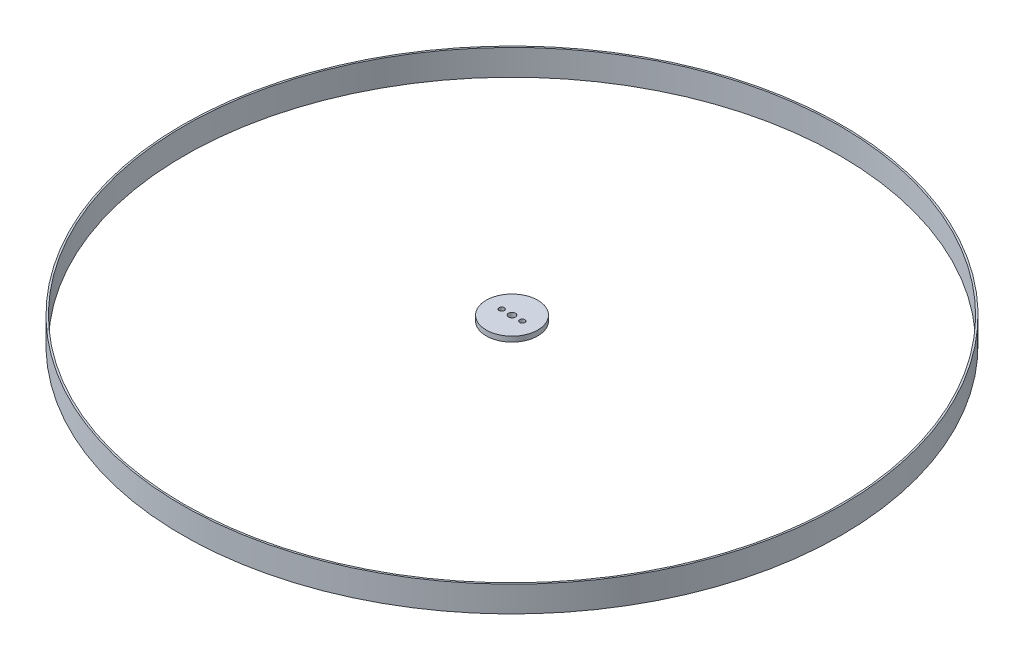
ISO-10303-21;
HEADER;
FILE_DESCRIPTION(('STEP AP214'),'2;1');
FILE_NAME('part.step','',(''),(''),'','','');
FILE_SCHEMA(('AUTOMOTIVE_DESIGN { 1 0 10303 214 1 1 1 1 }'));
ENDSEC;
DATA;
#1=APPLICATION_CONTEXT('core data for automotive mechanical design processes');
#2=APPLICATION_PROTOCOL_DEFINITION('international standard','automotive_design',2000,#1);
#3=PRODUCT_CONTEXT('',#1,'mechanical');
#4=PRODUCT('Part','Part','',(#3));
#5=PRODUCT_RELATED_PRODUCT_CATEGORY('part','',(#4));
#6=PRODUCT_DEFINITION_FORMATION('','',#4);
#7=PRODUCT_DEFINITION_CONTEXT('part definition',#1,'design');
#8=PRODUCT_DEFINITION('design','',#6,#7);
#9=PRODUCT_DEFINITION_SHAPE('','',#8);
#10=(LENGTH_UNIT() NAMED_UNIT(*) SI_UNIT(.MILLI.,.METRE.));
#11=(NAMED_UNIT(*) PLANE_ANGLE_UNIT() SI_UNIT($,.RADIAN.));
#12=(NAMED_UNIT(*) SI_UNIT($,.STERADIAN.) SOLID_ANGLE_UNIT());
#13=UNCERTAINTY_MEASURE_WITH_UNIT(LENGTH_MEASURE(1.E-05),#10,'distance_accuracy_value','');
#14=(GEOMETRIC_REPRESENTATION_CONTEXT(3) GLOBAL_UNCERTAINTY_ASSIGNED_CONTEXT((#13)) GLOBAL_UNIT_ASSIGNED_CONTEXT((#10,
#11,#12)) REPRESENTATION_CONTEXT('',''));
#15=CARTESIAN_POINT('',(0.,0.,0.));
#16=DIRECTION('',(0.,0.,1.));
#17=DIRECTION('',(1.,0.,0.));
#18=AXIS2_PLACEMENT_3D('',#15,#16,#17);
#19=CARTESIAN_POINT('',(0.,-12.,0.));
#20=DIRECTION('',(0.,1.,0.));
#21=DIRECTION('',(0.,0.,1.));
#22=AXIS2_PLACEMENT_3D('',#19,#20,#21);
#23=CYLINDRICAL_SURFACE('',#22,191.5);
#24=CARTESIAN_POINT('',(0.,-12.,0.));
#25=DIRECTION('',(0.,1.,0.));
#26=DIRECTION('',(1.,0.,0.));
#27=AXIS2_PLACEMENT_3D('',#24,#25,#26);
#28=CIRCLE('',#27,191.5);
#29=CARTESIAN_POINT('',(191.5,-12.,0.));
#30=VERTEX_POINT('',#29);
#31=EDGE_CURVE('E12',#30,#30,#28,.T.);
#32=ORIENTED_EDGE('',*,*,#31,.T.);
#33=EDGE_LOOP('',(#32));
#34=FACE_BOUND('',#33,.T.);
#35=CARTESIAN_POINT('',(0.,3.,0.));
#36=DIRECTION('',(0.,1.,0.));
#37=DIRECTION('',(1.,0.,0.));
#38=AXIS2_PLACEMENT_3D('',#35,#36,#37);
#39=CIRCLE('',#38,191.5);
#40=CARTESIAN_POINT('',(191.5,3.,0.));
#41=VERTEX_POINT('',#40);
#42=EDGE_CURVE('E50',#41,#41,#39,.T.);
#43=ORIENTED_EDGE('',*,*,#42,.F.);
#44=EDGE_LOOP('',(#43));
#45=FACE_BOUND('',#44,.T.);
#46=ADVANCED_FACE('F47',(#34,#45),#23,.T.);
#47=CARTESIAN_POINT('',(0.,-12.,0.));
#48=DIRECTION('',(0.,1.,0.));
#49=DIRECTION('',(0.,0.,1.));
#50=AXIS2_PLACEMENT_3D('',#47,#48,#49);
#51=PLANE('',#50);
#52=CARTESIAN_POINT('',(0.,-12.,0.));
#53=DIRECTION('',(0.,1.,0.));
#54=DIRECTION('',(0.,0.,1.));
#55=AXIS2_PLACEMENT_3D('',#52,#53,#54);
#56=CIRCLE('',#55,190.5);
#57=CARTESIAN_POINT('',(0.,-12.,190.5));
#58=VERTEX_POINT('',#57);
#59=EDGE_CURVE('E57',#58,#58,#56,.T.);
#60=ORIENTED_EDGE('',*,*,#59,.T.);
#61=EDGE_LOOP('',(#60));
#62=FACE_BOUND('',#61,.T.);
#63=ORIENTED_EDGE('',*,*,#31,.F.);
#64=EDGE_LOOP('',(#63));
#65=FACE_BOUND('',#64,.T.);
#66=ADVANCED_FACE('F65',(#62,#65),#51,.F.);
#67=CARTESIAN_POINT('',(0.,3.,0.));
#68=DIRECTION('',(0.,1.,0.));
#69=DIRECTION('',(0.,0.,1.));
#70=AXIS2_PLACEMENT_3D('',#67,#68,#69);
#71=PLANE('',#70);
#72=CARTESIAN_POINT('',(0.,3.,0.));
#73=DIRECTION('',(0.,1.,0.));
#74=DIRECTION('',(0.,0.,1.));
#75=AXIS2_PLACEMENT_3D('',#72,#73,#74);
#76=CIRCLE('',#75,190.5);
#77=CARTESIAN_POINT('',(0.,3.,190.5));
#78=VERTEX_POINT('',#77);
#79=EDGE_CURVE('E59',#78,#78,#76,.T.);
#80=ORIENTED_EDGE('',*,*,#79,.F.);
#81=EDGE_LOOP('',(#80));
#82=FACE_BOUND('',#81,.T.);
#83=ORIENTED_EDGE('',*,*,#42,.T.);
#84=EDGE_LOOP('',(#83));
#85=FACE_BOUND('',#84,.T.);
#86=ADVANCED_FACE('F71',(#82,#85),#71,.T.);
#87=CARTESIAN_POINT('',(0.,-12.,0.));
#88=DIRECTION('',(0.,1.,0.));
#89=DIRECTION('',(0.,0.,1.));
#90=AXIS2_PLACEMENT_3D('',#87,#88,#89);
#91=CYLINDRICAL_SURFACE('',#90,190.5);
#92=ORIENTED_EDGE('',*,*,#59,.F.);
#93=EDGE_LOOP('',(#92));
#94=FACE_BOUND('',#93,.T.);
#95=ORIENTED_EDGE('',*,*,#79,.T.);
#96=EDGE_LOOP('',(#95));
#97=FACE_BOUND('',#96,.T.);
#98=ADVANCED_FACE('F68',(#94,#97),#91,.F.);
#99=CLOSED_SHELL('',(#46,#66,#86,#98));
#100=MANIFOLD_SOLID_BREP('B2',#99);
#101=CARTESIAN_POINT('',(-6.,3.,0.));
#102=DIRECTION('',(0.,-1.,0.));
#103=DIRECTION('',(0.,0.,-1.));
#104=AXIS2_PLACEMENT_3D('',#101,#102,#103);
#105=CYLINDRICAL_SURFACE('',#104,1.5);
#106=CARTESIAN_POINT('',(-6.,3.,0.));
#107=DIRECTION('',(0.,1.,0.));
#108=DIRECTION('',(0.,0.,1.));
#109=AXIS2_PLACEMENT_3D('',#106,#107,#108);
#110=CIRCLE('',#109,1.5);
#111=CARTESIAN_POINT('',(-6.,3.,1.49999999999996));
#112=VERTEX_POINT('',#111);
#113=EDGE_CURVE('E117',#112,#112,#110,.T.);
#114=ORIENTED_EDGE('',*,*,#113,.T.);
#115=EDGE_LOOP('',(#114));
#116=FACE_BOUND('',#115,.T.);
#117=CARTESIAN_POINT('',(-6.,0.,0.));
#118=DIRECTION('',(0.,1.,0.));
#119=DIRECTION('',(0.,0.,1.));
#120=AXIS2_PLACEMENT_3D('',#117,#118,#119);
#121=CIRCLE('',#120,1.5);
#122=CARTESIAN_POINT('',(-6.,0.,1.49999999999996));
#123=VERTEX_POINT('',#122);
#124=EDGE_CURVE('E131',#123,#123,#121,.T.);
#125=ORIENTED_EDGE('',*,*,#124,.F.);
#126=EDGE_LOOP('',(#125));
#127=FACE_BOUND('',#126,.T.);
#128=ADVANCED_FACE('F109',(#116,#127),#105,.F.);
#129=CARTESIAN_POINT('',(6.,3.,0.));
#130=DIRECTION('',(0.,-1.,0.));
#131=DIRECTION('',(0.,0.,-1.));
#132=AXIS2_PLACEMENT_3D('',#129,#130,#131);
#133=CYLINDRICAL_SURFACE('',#132,1.5);
#134=CARTESIAN_POINT('',(6.,3.,0.));
#135=DIRECTION('',(0.,1.,0.));
#136=DIRECTION('',(0.,0.,1.));
#137=AXIS2_PLACEMENT_3D('',#134,#135,#136);
#138=CIRCLE('',#137,1.5);
#139=CARTESIAN_POINT('',(6.,3.,1.5));
#140=VERTEX_POINT('',#139);
#141=EDGE_CURVE('E122',#140,#140,#138,.T.);
#142=ORIENTED_EDGE('',*,*,#141,.T.);
#143=EDGE_LOOP('',(#142));
#144=FACE_BOUND('',#143,.T.);
#145=CARTESIAN_POINT('',(6.,0.,0.));
#146=DIRECTION('',(0.,1.,0.));
#147=DIRECTION('',(0.,0.,1.));
#148=AXIS2_PLACEMENT_3D('',#145,#146,#147);
#149=CIRCLE('',#148,1.5);
#150=CARTESIAN_POINT('',(6.,0.,1.5));
#151=VERTEX_POINT('',#150);
#152=EDGE_CURVE('E129',#151,#151,#149,.T.);
#153=ORIENTED_EDGE('',*,*,#152,.F.);
#154=EDGE_LOOP('',(#153));
#155=FACE_BOUND('',#154,.T.);
#156=ADVANCED_FACE('F146',(#144,#155),#133,.F.);
#157=CARTESIAN_POINT('',(0.,3.,0.));
#158=DIRECTION('',(0.,-1.,0.));
#159=DIRECTION('',(0.,0.,-1.));
#160=AXIS2_PLACEMENT_3D('',#157,#158,#159);
#161=CYLINDRICAL_SURFACE('',#160,2.);
#162=CARTESIAN_POINT('',(0.,3.,0.));
#163=DIRECTION('',(0.,1.,0.));
#164=DIRECTION('',(0.,0.,1.));
#165=AXIS2_PLACEMENT_3D('',#162,#163,#164);
#166=CIRCLE('',#165,2.);
#167=CARTESIAN_POINT('',(0.,3.,2.));
#168=VERTEX_POINT('',#167);
#169=EDGE_CURVE('E136',#168,#168,#166,.T.);
#170=ORIENTED_EDGE('',*,*,#169,.T.);
#171=EDGE_LOOP('',(#170));
#172=FACE_BOUND('',#171,.T.);
#173=CARTESIAN_POINT('',(0.,0.,0.));
#174=DIRECTION('',(0.,1.,0.));
#175=DIRECTION('',(0.,0.,1.));
#176=AXIS2_PLACEMENT_3D('',#173,#174,#175);
#177=CIRCLE('',#176,2.);
#178=CARTESIAN_POINT('',(0.,0.,2.));
#179=VERTEX_POINT('',#178);
#180=EDGE_CURVE('E126',#179,#179,#177,.T.);
#181=ORIENTED_EDGE('',*,*,#180,.F.);
#182=EDGE_LOOP('',(#181));
#183=FACE_BOUND('',#182,.T.);
#184=ADVANCED_FACE('F111',(#172,#183),#161,.F.);
#185=CARTESIAN_POINT('',(0.,3.,0.));
#186=DIRECTION('',(0.,-1.,0.));
#187=DIRECTION('',(0.,0.,-1.));
#188=AXIS2_PLACEMENT_3D('',#185,#186,#187);
#189=CYLINDRICAL_SURFACE('',#188,15.);
#190=CARTESIAN_POINT('',(0.,3.,0.));
#191=DIRECTION('',(0.,1.,0.));
#192=DIRECTION('',(0.,0.,1.));
#193=AXIS2_PLACEMENT_3D('',#190,#191,#192);
#194=CIRCLE('',#193,15.);
#195=CARTESIAN_POINT('',(0.,3.,15.));
#196=VERTEX_POINT('',#195);
#197=EDGE_CURVE('E46',#196,#196,#194,.T.);
#198=ORIENTED_EDGE('',*,*,#197,.F.);
#199=EDGE_LOOP('',(#198));
#200=FACE_BOUND('',#199,.T.);
#201=CARTESIAN_POINT('',(0.,0.,0.));
#202=DIRECTION('',(0.,1.,0.));
#203=DIRECTION('',(0.,0.,1.));
#204=AXIS2_PLACEMENT_3D('',#201,#202,#203);
#205=CIRCLE('',#204,15.);
#206=CARTESIAN_POINT('',(0.,0.,15.));
#207=VERTEX_POINT('',#206);
#208=EDGE_CURVE('E113',#207,#207,#205,.T.);
#209=ORIENTED_EDGE('',*,*,#208,.T.);
#210=EDGE_LOOP('',(#209));
#211=FACE_BOUND('',#210,.T.);
#212=ADVANCED_FACE('F153',(#200,#211),#189,.T.);
#213=CARTESIAN_POINT('',(0.,3.,0.));
#214=DIRECTION('',(0.,1.,0.));
#215=DIRECTION('',(0.,0.,1.));
#216=AXIS2_PLACEMENT_3D('',#213,#214,#215);
#217=PLANE('',#216);
#218=ORIENTED_EDGE('',*,*,#169,.F.);
#219=EDGE_LOOP('',(#218));
#220=FACE_BOUND('',#219,.T.);
#221=ORIENTED_EDGE('',*,*,#141,.F.);
#222=EDGE_LOOP('',(#221));
#223=FACE_BOUND('',#222,.T.);
#224=ORIENTED_EDGE('',*,*,#113,.F.);
#225=EDGE_LOOP('',(#224));
#226=FACE_BOUND('',#225,.T.);
#227=ORIENTED_EDGE('',*,*,#197,.T.);
#228=EDGE_LOOP('',(#227));
#229=FACE_BOUND('',#228,.T.);
#230=ADVANCED_FACE('F149',(#220,#223,#226,#229),#217,.T.);
#231=CARTESIAN_POINT('',(0.,0.,0.));
#232=DIRECTION('',(0.,1.,0.));
#233=DIRECTION('',(0.,0.,1.));
#234=AXIS2_PLACEMENT_3D('',#231,#232,#233);
#235=PLANE('',#234);
#236=ORIENTED_EDGE('',*,*,#180,.T.);
#237=EDGE_LOOP('',(#236));
#238=FACE_BOUND('',#237,.T.);
#239=ORIENTED_EDGE('',*,*,#152,.T.);
#240=EDGE_LOOP('',(#239));
#241=FACE_BOUND('',#240,.T.);
#242=ORIENTED_EDGE('',*,*,#124,.T.);
#243=EDGE_LOOP('',(#242));
#244=FACE_BOUND('',#243,.T.);
#245=ORIENTED_EDGE('',*,*,#208,.F.);
#246=EDGE_LOOP('',(#245));
#247=FACE_BOUND('',#246,.T.);
#248=ADVANCED_FACE('F152',(#238,#241,#244,#247),#235,.F.);
#249=CLOSED_SHELL('',(#128,#156,#184,#212,#230,#248));
#250=MANIFOLD_SOLID_BREP('B7',#249);
#251=ADVANCED_BREP_SHAPE_REPRESENTATION('',(#18,#100,#250),#14);
#252=SHAPE_DEFINITION_REPRESENTATION(#9,#251);
ENDSEC;
END-ISO-10303-21;
